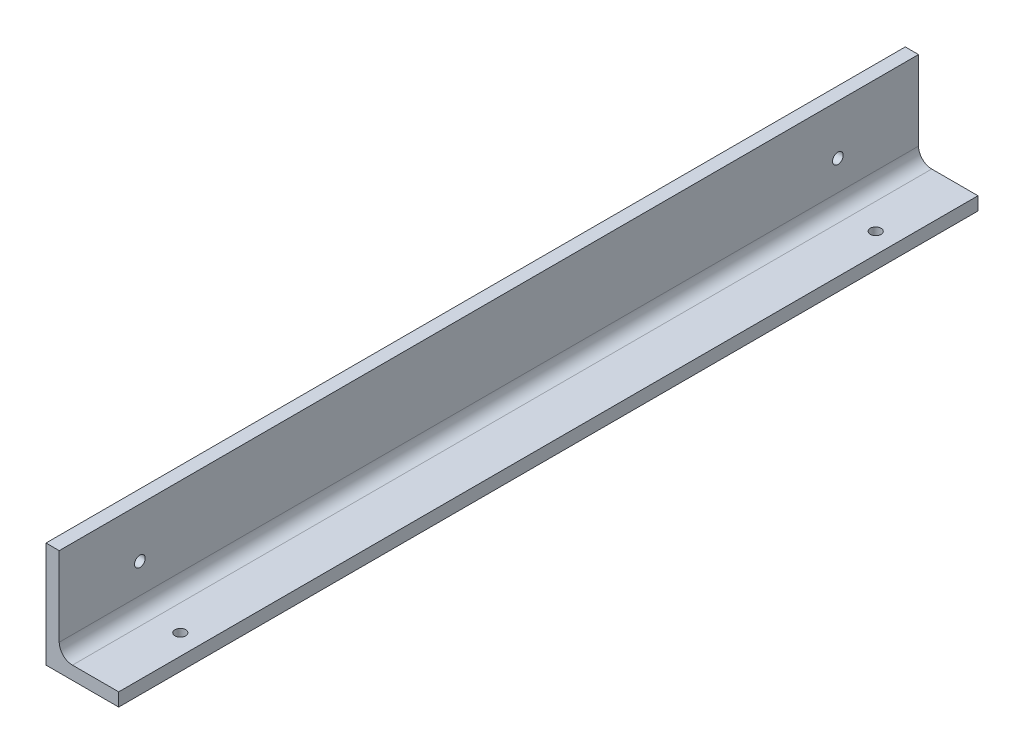
ISO-10303-21;
HEADER;
FILE_DESCRIPTION(('STEP AP214'),'2;1');
FILE_NAME('part.step','',(''),(''),'','','');
FILE_SCHEMA(('AUTOMOTIVE_DESIGN { 1 0 10303 214 1 1 1 1 }'));
ENDSEC;
DATA;
#1=APPLICATION_CONTEXT('core data for automotive mechanical design processes');
#2=APPLICATION_PROTOCOL_DEFINITION('international standard','automotive_design',2000,#1);
#3=PRODUCT_CONTEXT('',#1,'mechanical');
#4=PRODUCT('Part','Part','',(#3));
#5=PRODUCT_RELATED_PRODUCT_CATEGORY('part','',(#4));
#6=PRODUCT_DEFINITION_FORMATION('','',#4);
#7=PRODUCT_DEFINITION_CONTEXT('part definition',#1,'design');
#8=PRODUCT_DEFINITION('design','',#6,#7);
#9=PRODUCT_DEFINITION_SHAPE('','',#8);
#10=(LENGTH_UNIT() NAMED_UNIT(*) SI_UNIT(.MILLI.,.METRE.));
#11=(NAMED_UNIT(*) PLANE_ANGLE_UNIT() SI_UNIT($,.RADIAN.));
#12=(NAMED_UNIT(*) SI_UNIT($,.STERADIAN.) SOLID_ANGLE_UNIT());
#13=UNCERTAINTY_MEASURE_WITH_UNIT(LENGTH_MEASURE(1.E-05),#10,'distance_accuracy_value','');
#14=(GEOMETRIC_REPRESENTATION_CONTEXT(3) GLOBAL_UNCERTAINTY_ASSIGNED_CONTEXT((#13)) GLOBAL_UNIT_ASSIGNED_CONTEXT((#10,
#11,#12)) REPRESENTATION_CONTEXT('',''));
#15=CARTESIAN_POINT('',(0.,0.,0.));
#16=DIRECTION('',(0.,0.,1.));
#17=DIRECTION('',(1.,0.,0.));
#18=AXIS2_PLACEMENT_3D('',#15,#16,#17);
#19=CARTESIAN_POINT('',(12.7,12.7,0.));
#20=DIRECTION('',(0.,0.,1.));
#21=DIRECTION('',(1.,0.,0.));
#22=AXIS2_PLACEMENT_3D('',#19,#20,#21);
#23=PLANE('',#22);
#24=DIRECTION('',(1.,0.,0.));
#25=VECTOR('',#24,1.);
#26=CARTESIAN_POINT('',(34.925,0.,0.));
#27=LINE('',#26,#25);
#28=CARTESIAN_POINT('',(0.,0.,0.));
#29=VERTEX_POINT('',#28);
#30=CARTESIAN_POINT('',(34.925,0.,0.));
#31=VERTEX_POINT('',#30);
#32=EDGE_CURVE('E106',#29,#31,#27,.T.);
#33=ORIENTED_EDGE('',*,*,#32,.F.);
#34=DIRECTION('',(0.,-1.,0.));
#35=VECTOR('',#34,1.);
#36=CARTESIAN_POINT('',(0.,0.,0.));
#37=LINE('',#36,#35);
#38=CARTESIAN_POINT('',(0.,50.8,0.));
#39=VERTEX_POINT('',#38);
#40=EDGE_CURVE('E131',#39,#29,#37,.T.);
#41=ORIENTED_EDGE('',*,*,#40,.F.);
#42=DIRECTION('',(-1.,0.,0.));
#43=VECTOR('',#42,1.);
#44=CARTESIAN_POINT('',(0.,50.8,0.));
#45=LINE('',#44,#43);
#46=CARTESIAN_POINT('',(6.35,50.8,0.));
#47=VERTEX_POINT('',#46);
#48=EDGE_CURVE('E128',#47,#39,#45,.T.);
#49=ORIENTED_EDGE('',*,*,#48,.F.);
#50=DIRECTION('',(0.,1.,0.));
#51=VECTOR('',#50,1.);
#52=CARTESIAN_POINT('',(6.35,50.8,0.));
#53=LINE('',#52,#51);
#54=CARTESIAN_POINT('',(6.35000000000001,12.7,0.));
#55=VERTEX_POINT('',#54);
#56=EDGE_CURVE('E125',#55,#47,#53,.T.);
#57=ORIENTED_EDGE('',*,*,#56,.F.);
#58=CARTESIAN_POINT('',(12.7,12.7,0.));
#59=DIRECTION('',(0.,0.,-1.));
#60=DIRECTION('',(1.,0.,0.));
#61=AXIS2_PLACEMENT_3D('',#58,#59,#60);
#62=CIRCLE('',#61,6.35);
#63=CARTESIAN_POINT('',(12.7,6.35,0.));
#64=VERTEX_POINT('',#63);
#65=EDGE_CURVE('E122',#64,#55,#62,.T.);
#66=ORIENTED_EDGE('',*,*,#65,.F.);
#67=DIRECTION('',(-1.,0.,0.));
#68=VECTOR('',#67,1.);
#69=CARTESIAN_POINT('',(12.7,6.35,0.));
#70=LINE('',#69,#68);
#71=CARTESIAN_POINT('',(34.925,6.34999999999999,0.));
#72=VERTEX_POINT('',#71);
#73=EDGE_CURVE('E109',#72,#64,#70,.T.);
#74=ORIENTED_EDGE('',*,*,#73,.F.);
#75=DIRECTION('',(0.,1.,0.));
#76=VECTOR('',#75,1.);
#77=CARTESIAN_POINT('',(34.925,6.34999999999999,0.));
#78=LINE('',#77,#76);
#79=EDGE_CURVE('E98',#31,#72,#78,.T.);
#80=ORIENTED_EDGE('',*,*,#79,.F.);
#81=EDGE_LOOP('',(#33,#41,#49,#57,#66,#74,#80));
#82=FACE_BOUND('',#81,.T.);
#83=ADVANCED_FACE('F33',(#82),#23,.F.);
#84=CARTESIAN_POINT('',(0.,0.,474.397348888658));
#85=DIRECTION('',(1.,0.,0.));
#86=DIRECTION('',(0.,0.,-1.));
#87=AXIS2_PLACEMENT_3D('',#84,#85,#86);
#88=PLANE('',#87);
#89=CARTESIAN_POINT('',(0.,26.9875,38.7349999999999));
#90=DIRECTION('',(1.,0.,0.));
#91=DIRECTION('',(0.,1.,0.));
#92=AXIS2_PLACEMENT_3D('',#89,#90,#91);
#93=CIRCLE('',#92,2.5796875);
#94=CARTESIAN_POINT('',(0.,29.5671875,38.7349999999999));
#95=VERTEX_POINT('',#94);
#96=EDGE_CURVE('E154',#95,#95,#93,.T.);
#97=ORIENTED_EDGE('',*,*,#96,.T.);
#98=EDGE_LOOP('',(#97));
#99=FACE_BOUND('',#98,.T.);
#100=CARTESIAN_POINT('',(0.,27.0001999999999,374.015));
#101=DIRECTION('',(1.,0.,0.));
#102=DIRECTION('',(0.,1.,0.));
#103=AXIS2_PLACEMENT_3D('',#100,#101,#102);
#104=CIRCLE('',#103,2.57968750000001);
#105=CARTESIAN_POINT('',(0.,29.5798874999999,374.015));
#106=VERTEX_POINT('',#105);
#107=EDGE_CURVE('E114',#106,#106,#104,.T.);
#108=ORIENTED_EDGE('',*,*,#107,.T.);
#109=EDGE_LOOP('',(#108));
#110=FACE_BOUND('',#109,.T.);
#111=DIRECTION('',(0.,0.,-1.));
#112=VECTOR('',#111,1.);
#113=CARTESIAN_POINT('',(0.,0.,474.397348888658));
#114=LINE('',#113,#112);
#115=CARTESIAN_POINT('',(0.,0.,412.75));
#116=VERTEX_POINT('',#115);
#117=EDGE_CURVE('E112',#116,#29,#114,.T.);
#118=ORIENTED_EDGE('',*,*,#117,.F.);
#119=DIRECTION('',(0.,1.,0.));
#120=VECTOR('',#119,1.);
#121=CARTESIAN_POINT('',(0.,0.,412.75));
#122=LINE('',#121,#120);
#123=CARTESIAN_POINT('',(0.,50.8,412.75));
#124=VERTEX_POINT('',#123);
#125=EDGE_CURVE('E37',#116,#124,#122,.T.);
#126=ORIENTED_EDGE('',*,*,#125,.T.);
#127=DIRECTION('',(0.,0.,-1.));
#128=VECTOR('',#127,1.);
#129=CARTESIAN_POINT('',(0.,50.8,474.397348888658));
#130=LINE('',#129,#128);
#131=EDGE_CURVE('E134',#124,#39,#130,.T.);
#132=ORIENTED_EDGE('',*,*,#131,.T.);
#133=ORIENTED_EDGE('',*,*,#40,.T.);
#134=EDGE_LOOP('',(#118,#126,#132,#133));
#135=FACE_BOUND('',#134,.T.);
#136=ADVANCED_FACE('F201',(#99,#110,#135),#88,.F.);
#137=CARTESIAN_POINT('',(0.,50.8,474.397348888658));
#138=DIRECTION('',(0.,-1.,0.));
#139=DIRECTION('',(0.,0.,-1.));
#140=AXIS2_PLACEMENT_3D('',#137,#138,#139);
#141=PLANE('',#140);
#142=ORIENTED_EDGE('',*,*,#131,.F.);
#143=DIRECTION('',(1.,0.,0.));
#144=VECTOR('',#143,1.);
#145=CARTESIAN_POINT('',(0.,50.8,412.75));
#146=LINE('',#145,#144);
#147=CARTESIAN_POINT('',(6.35,50.8,412.75));
#148=VERTEX_POINT('',#147);
#149=EDGE_CURVE('E150',#124,#148,#146,.T.);
#150=ORIENTED_EDGE('',*,*,#149,.T.);
#151=DIRECTION('',(0.,0.,-1.));
#152=VECTOR('',#151,1.);
#153=CARTESIAN_POINT('',(6.35,50.8,474.397348888658));
#154=LINE('',#153,#152);
#155=EDGE_CURVE('E136',#148,#47,#154,.T.);
#156=ORIENTED_EDGE('',*,*,#155,.T.);
#157=ORIENTED_EDGE('',*,*,#48,.T.);
#158=EDGE_LOOP('',(#142,#150,#156,#157));
#159=FACE_BOUND('',#158,.T.);
#160=ADVANCED_FACE('F206',(#159),#141,.F.);
#161=CARTESIAN_POINT('',(6.35,50.8,474.397348888658));
#162=DIRECTION('',(-1.,0.,0.));
#163=DIRECTION('',(0.,-1.,0.));
#164=AXIS2_PLACEMENT_3D('',#161,#162,#163);
#165=PLANE('',#164);
#166=CARTESIAN_POINT('',(6.35000000000001,26.9875,38.7349999999999));
#167=DIRECTION('',(1.,0.,0.));
#168=DIRECTION('',(0.,1.,0.));
#169=AXIS2_PLACEMENT_3D('',#166,#167,#168);
#170=CIRCLE('',#169,2.5796875);
#171=CARTESIAN_POINT('',(6.35,29.5671875,38.7349999999999));
#172=VERTEX_POINT('',#171);
#173=EDGE_CURVE('E156',#172,#172,#170,.T.);
#174=ORIENTED_EDGE('',*,*,#173,.F.);
#175=EDGE_LOOP('',(#174));
#176=FACE_BOUND('',#175,.T.);
#177=CARTESIAN_POINT('',(6.35000000000001,27.0001999999999,374.015));
#178=DIRECTION('',(1.,0.,0.));
#179=DIRECTION('',(0.,1.,0.));
#180=AXIS2_PLACEMENT_3D('',#177,#178,#179);
#181=CIRCLE('',#180,2.57968750000001);
#182=CARTESIAN_POINT('',(6.35,29.5798874999999,374.015));
#183=VERTEX_POINT('',#182);
#184=EDGE_CURVE('E117',#183,#183,#181,.T.);
#185=ORIENTED_EDGE('',*,*,#184,.F.);
#186=EDGE_LOOP('',(#185));
#187=FACE_BOUND('',#186,.T.);
#188=ORIENTED_EDGE('',*,*,#155,.F.);
#189=DIRECTION('',(0.,-1.,0.));
#190=VECTOR('',#189,1.);
#191=CARTESIAN_POINT('',(6.35,50.8,412.75));
#192=LINE('',#191,#190);
#193=CARTESIAN_POINT('',(6.35000000000001,12.7,412.75));
#194=VERTEX_POINT('',#193);
#195=EDGE_CURVE('E52',#148,#194,#192,.T.);
#196=ORIENTED_EDGE('',*,*,#195,.T.);
#197=DIRECTION('',(0.,0.,-1.));
#198=VECTOR('',#197,1.);
#199=CARTESIAN_POINT('',(6.35000000000001,12.7,474.397348888658));
#200=LINE('',#199,#198);
#201=EDGE_CURVE('E138',#194,#55,#200,.T.);
#202=ORIENTED_EDGE('',*,*,#201,.T.);
#203=ORIENTED_EDGE('',*,*,#56,.T.);
#204=EDGE_LOOP('',(#188,#196,#202,#203));
#205=FACE_BOUND('',#204,.T.);
#206=ADVANCED_FACE('F215',(#176,#187,#205),#165,.F.);
#207=CARTESIAN_POINT('',(12.7,12.7,474.397348888658));
#208=DIRECTION('',(0.,0.,-1.));
#209=DIRECTION('',(-1.,0.,0.));
#210=AXIS2_PLACEMENT_3D('',#207,#208,#209);
#211=CYLINDRICAL_SURFACE('',#210,6.35);
#212=ORIENTED_EDGE('',*,*,#201,.F.);
#213=CARTESIAN_POINT('',(12.7,12.7,412.75));
#214=DIRECTION('',(0.,0.,-1.));
#215=DIRECTION('',(0.,1.,0.));
#216=AXIS2_PLACEMENT_3D('',#213,#214,#215);
#217=CIRCLE('',#216,6.35);
#218=CARTESIAN_POINT('',(12.7,6.35,412.75));
#219=VERTEX_POINT('',#218);
#220=EDGE_CURVE('E145',#194,#219,#217,.F.);
#221=ORIENTED_EDGE('',*,*,#220,.T.);
#222=DIRECTION('',(0.,0.,-1.));
#223=VECTOR('',#222,1.);
#224=CARTESIAN_POINT('',(12.7,6.35,474.397348888658));
#225=LINE('',#224,#223);
#226=EDGE_CURVE('E140',#219,#64,#225,.T.);
#227=ORIENTED_EDGE('',*,*,#226,.T.);
#228=ORIENTED_EDGE('',*,*,#65,.T.);
#229=EDGE_LOOP('',(#212,#221,#227,#228));
#230=FACE_BOUND('',#229,.T.);
#231=ADVANCED_FACE('F185',(#230),#211,.F.);
#232=CARTESIAN_POINT('',(12.7,6.35,474.397348888658));
#233=DIRECTION('',(0.,-1.,0.));
#234=DIRECTION('',(1.,0.,0.));
#235=AXIS2_PLACEMENT_3D('',#232,#233,#234);
#236=PLANE('',#235);
#237=CARTESIAN_POINT('',(25.146,6.34999999999999,39.37));
#238=DIRECTION('',(0.,1.,0.));
#239=DIRECTION('',(-1.,0.,0.));
#240=AXIS2_PLACEMENT_3D('',#237,#238,#239);
#241=CIRCLE('',#240,2.5796875);
#242=CARTESIAN_POINT('',(22.5663125,6.35,39.37));
#243=VERTEX_POINT('',#242);
#244=EDGE_CURVE('E168',#243,#243,#241,.T.);
#245=ORIENTED_EDGE('',*,*,#244,.F.);
#246=EDGE_LOOP('',(#245));
#247=FACE_BOUND('',#246,.T.);
#248=CARTESIAN_POINT('',(25.146,6.34999999999999,373.38));
#249=DIRECTION('',(0.,1.,0.));
#250=DIRECTION('',(-1.,0.,0.));
#251=AXIS2_PLACEMENT_3D('',#248,#249,#250);
#252=CIRCLE('',#251,2.5796875);
#253=CARTESIAN_POINT('',(22.5663125,6.35,373.38));
#254=VERTEX_POINT('',#253);
#255=EDGE_CURVE('E162',#254,#254,#252,.T.);
#256=ORIENTED_EDGE('',*,*,#255,.F.);
#257=EDGE_LOOP('',(#256));
#258=FACE_BOUND('',#257,.T.);
#259=ORIENTED_EDGE('',*,*,#226,.F.);
#260=DIRECTION('',(1.,0.,0.));
#261=VECTOR('',#260,1.);
#262=CARTESIAN_POINT('',(12.7,6.35,412.75));
#263=LINE('',#262,#261);
#264=CARTESIAN_POINT('',(34.925,6.34999999999999,412.75));
#265=VERTEX_POINT('',#264);
#266=EDGE_CURVE('E62',#219,#265,#263,.T.);
#267=ORIENTED_EDGE('',*,*,#266,.T.);
#268=DIRECTION('',(0.,0.,-1.));
#269=VECTOR('',#268,1.);
#270=CARTESIAN_POINT('',(34.925,6.34999999999999,474.397348888658));
#271=LINE('',#270,#269);
#272=EDGE_CURVE('E102',#265,#72,#271,.T.);
#273=ORIENTED_EDGE('',*,*,#272,.T.);
#274=ORIENTED_EDGE('',*,*,#73,.T.);
#275=EDGE_LOOP('',(#259,#267,#273,#274));
#276=FACE_BOUND('',#275,.T.);
#277=ADVANCED_FACE('F143',(#247,#258,#276),#236,.F.);
#278=CARTESIAN_POINT('',(34.925,6.34999999999999,474.397348888658));
#279=DIRECTION('',(-1.,0.,0.));
#280=DIRECTION('',(0.,0.,1.));
#281=AXIS2_PLACEMENT_3D('',#278,#279,#280);
#282=PLANE('',#281);
#283=ORIENTED_EDGE('',*,*,#272,.F.);
#284=DIRECTION('',(0.,-1.,0.));
#285=VECTOR('',#284,1.);
#286=CARTESIAN_POINT('',(34.925,6.35,412.75));
#287=LINE('',#286,#285);
#288=CARTESIAN_POINT('',(34.925,0.,412.75));
#289=VERTEX_POINT('',#288);
#290=EDGE_CURVE('E43',#265,#289,#287,.T.);
#291=ORIENTED_EDGE('',*,*,#290,.T.);
#292=DIRECTION('',(0.,0.,-1.));
#293=VECTOR('',#292,1.);
#294=CARTESIAN_POINT('',(34.925,0.,474.397348888658));
#295=LINE('',#294,#293);
#296=EDGE_CURVE('E95',#289,#31,#295,.T.);
#297=ORIENTED_EDGE('',*,*,#296,.T.);
#298=ORIENTED_EDGE('',*,*,#79,.T.);
#299=EDGE_LOOP('',(#283,#291,#297,#298));
#300=FACE_BOUND('',#299,.T.);
#301=ADVANCED_FACE('F97',(#300),#282,.F.);
#302=CARTESIAN_POINT('',(34.925,0.,474.397348888658));
#303=DIRECTION('',(0.,1.,0.));
#304=DIRECTION('',(-1.,0.,0.));
#305=AXIS2_PLACEMENT_3D('',#302,#303,#304);
#306=PLANE('',#305);
#307=CARTESIAN_POINT('',(25.146,0.,39.37));
#308=DIRECTION('',(0.,1.,0.));
#309=DIRECTION('',(-1.,0.,0.));
#310=AXIS2_PLACEMENT_3D('',#307,#308,#309);
#311=CIRCLE('',#310,2.5796875);
#312=CARTESIAN_POINT('',(22.5663125,0.,39.37));
#313=VERTEX_POINT('',#312);
#314=EDGE_CURVE('E165',#313,#313,#311,.T.);
#315=ORIENTED_EDGE('',*,*,#314,.T.);
#316=EDGE_LOOP('',(#315));
#317=FACE_BOUND('',#316,.T.);
#318=CARTESIAN_POINT('',(25.146,0.,373.38));
#319=DIRECTION('',(0.,1.,0.));
#320=DIRECTION('',(-1.,0.,0.));
#321=AXIS2_PLACEMENT_3D('',#318,#319,#320);
#322=CIRCLE('',#321,2.5796875);
#323=CARTESIAN_POINT('',(22.5663125,0.,373.38));
#324=VERTEX_POINT('',#323);
#325=EDGE_CURVE('E159',#324,#324,#322,.T.);
#326=ORIENTED_EDGE('',*,*,#325,.T.);
#327=EDGE_LOOP('',(#326));
#328=FACE_BOUND('',#327,.T.);
#329=ORIENTED_EDGE('',*,*,#296,.F.);
#330=DIRECTION('',(-1.,0.,0.));
#331=VECTOR('',#330,1.);
#332=CARTESIAN_POINT('',(34.925,0.,412.75));
#333=LINE('',#332,#331);
#334=EDGE_CURVE('E11',#289,#116,#333,.T.);
#335=ORIENTED_EDGE('',*,*,#334,.T.);
#336=ORIENTED_EDGE('',*,*,#117,.T.);
#337=ORIENTED_EDGE('',*,*,#32,.T.);
#338=EDGE_LOOP('',(#329,#335,#336,#337));
#339=FACE_BOUND('',#338,.T.);
#340=ADVANCED_FACE('F35',(#317,#328,#339),#306,.F.);
#341=CARTESIAN_POINT('',(-6.604,0.,412.75));
#342=DIRECTION('',(0.,0.,-1.));
#343=DIRECTION('',(0.,-1.,0.));
#344=AXIS2_PLACEMENT_3D('',#341,#342,#343);
#345=PLANE('',#344);
#346=ORIENTED_EDGE('',*,*,#290,.F.);
#347=ORIENTED_EDGE('',*,*,#266,.F.);
#348=ORIENTED_EDGE('',*,*,#220,.F.);
#349=ORIENTED_EDGE('',*,*,#195,.F.);
#350=ORIENTED_EDGE('',*,*,#149,.F.);
#351=ORIENTED_EDGE('',*,*,#125,.F.);
#352=ORIENTED_EDGE('',*,*,#334,.F.);
#353=EDGE_LOOP('',(#346,#347,#348,#349,#350,#351,#352));
#354=FACE_BOUND('',#353,.T.);
#355=ADVANCED_FACE('F210',(#354),#345,.F.);
#356=CARTESIAN_POINT('',(0.,27.0001999999999,374.015));
#357=DIRECTION('',(1.,0.,0.));
#358=DIRECTION('',(0.,1.,0.));
#359=AXIS2_PLACEMENT_3D('',#356,#357,#358);
#360=CYLINDRICAL_SURFACE('',#359,2.57968750000001);
#361=ORIENTED_EDGE('',*,*,#107,.F.);
#362=EDGE_LOOP('',(#361));
#363=FACE_BOUND('',#362,.T.);
#364=ORIENTED_EDGE('',*,*,#184,.T.);
#365=EDGE_LOOP('',(#364));
#366=FACE_BOUND('',#365,.T.);
#367=ADVANCED_FACE('F196',(#363,#366),#360,.F.);
#368=CARTESIAN_POINT('',(0.,26.9875,38.7349999999999));
#369=DIRECTION('',(1.,0.,0.));
#370=DIRECTION('',(0.,1.,0.));
#371=AXIS2_PLACEMENT_3D('',#368,#369,#370);
#372=CYLINDRICAL_SURFACE('',#371,2.5796875);
#373=ORIENTED_EDGE('',*,*,#96,.F.);
#374=EDGE_LOOP('',(#373));
#375=FACE_BOUND('',#374,.T.);
#376=ORIENTED_EDGE('',*,*,#173,.T.);
#377=EDGE_LOOP('',(#376));
#378=FACE_BOUND('',#377,.T.);
#379=ADVANCED_FACE('F190',(#375,#378),#372,.F.);
#380=CARTESIAN_POINT('',(25.146,0.,373.38));
#381=DIRECTION('',(0.,1.,0.));
#382=DIRECTION('',(-1.,0.,0.));
#383=AXIS2_PLACEMENT_3D('',#380,#381,#382);
#384=CYLINDRICAL_SURFACE('',#383,2.5796875);
#385=ORIENTED_EDGE('',*,*,#325,.F.);
#386=EDGE_LOOP('',(#385));
#387=FACE_BOUND('',#386,.T.);
#388=ORIENTED_EDGE('',*,*,#255,.T.);
#389=EDGE_LOOP('',(#388));
#390=FACE_BOUND('',#389,.T.);
#391=ADVANCED_FACE('F179',(#387,#390),#384,.F.);
#392=CARTESIAN_POINT('',(25.146,0.,39.37));
#393=DIRECTION('',(0.,1.,0.));
#394=DIRECTION('',(-1.,0.,0.));
#395=AXIS2_PLACEMENT_3D('',#392,#393,#394);
#396=CYLINDRICAL_SURFACE('',#395,2.5796875);
#397=ORIENTED_EDGE('',*,*,#314,.F.);
#398=EDGE_LOOP('',(#397));
#399=FACE_BOUND('',#398,.T.);
#400=ORIENTED_EDGE('',*,*,#244,.T.);
#401=EDGE_LOOP('',(#400));
#402=FACE_BOUND('',#401,.T.);
#403=ADVANCED_FACE('F176',(#399,#402),#396,.F.);
#404=CLOSED_SHELL('',(#83,#136,#160,#206,#231,#277,#301,#340,#355,#367,#379,#391,#403));
#405=MANIFOLD_SOLID_BREP('B2',#404);
#406=ADVANCED_BREP_SHAPE_REPRESENTATION('',(#18,#405),#14);
#407=SHAPE_DEFINITION_REPRESENTATION(#9,#406);
ENDSEC;
END-ISO-10303-21;
